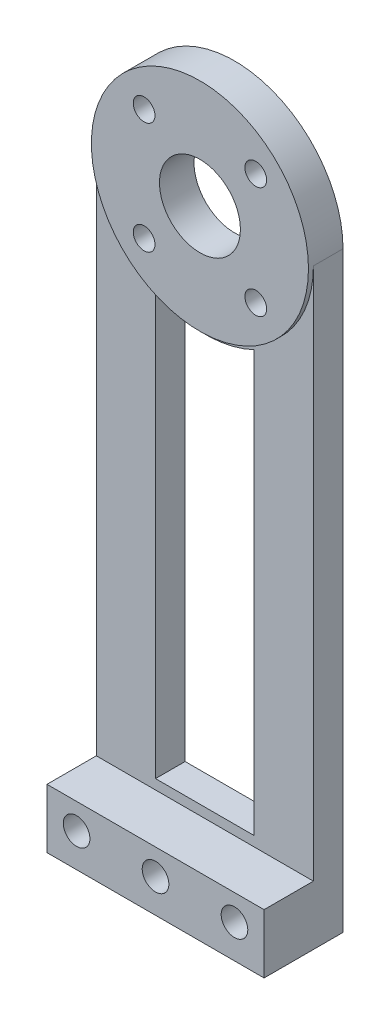
ISO-10303-21;
HEADER;
FILE_DESCRIPTION(('STEP AP214'),'2;1');
FILE_NAME('part.step','',(''),(''),'','','');
FILE_SCHEMA(('AUTOMOTIVE_DESIGN { 1 0 10303 214 1 1 1 1 }'));
ENDSEC;
DATA;
#1=APPLICATION_CONTEXT('core data for automotive mechanical design processes');
#2=APPLICATION_PROTOCOL_DEFINITION('international standard','automotive_design',2000,#1);
#3=PRODUCT_CONTEXT('',#1,'mechanical');
#4=PRODUCT('Part','Part','',(#3));
#5=PRODUCT_RELATED_PRODUCT_CATEGORY('part','',(#4));
#6=PRODUCT_DEFINITION_FORMATION('','',#4);
#7=PRODUCT_DEFINITION_CONTEXT('part definition',#1,'design');
#8=PRODUCT_DEFINITION('design','',#6,#7);
#9=PRODUCT_DEFINITION_SHAPE('','',#8);
#10=(LENGTH_UNIT() NAMED_UNIT(*) SI_UNIT(.MILLI.,.METRE.));
#11=(NAMED_UNIT(*) PLANE_ANGLE_UNIT() SI_UNIT($,.RADIAN.));
#12=(NAMED_UNIT(*) SI_UNIT($,.STERADIAN.) SOLID_ANGLE_UNIT());
#13=UNCERTAINTY_MEASURE_WITH_UNIT(LENGTH_MEASURE(1.E-05),#10,'distance_accuracy_value','');
#14=(GEOMETRIC_REPRESENTATION_CONTEXT(3) GLOBAL_UNCERTAINTY_ASSIGNED_CONTEXT((#13)) GLOBAL_UNIT_ASSIGNED_CONTEXT((#10,
#11,#12)) REPRESENTATION_CONTEXT('',''));
#15=CARTESIAN_POINT('',(0.,0.,0.));
#16=DIRECTION('',(0.,0.,1.));
#17=DIRECTION('',(1.,0.,0.));
#18=AXIS2_PLACEMENT_3D('',#15,#16,#17);
#19=CARTESIAN_POINT('',(-5.65685424949235,24.3431457505076,12.0965512114594));
#20=DIRECTION('',(0.,0.,-1.));
#21=DIRECTION('',(1.,0.,0.));
#22=AXIS2_PLACEMENT_3D('',#19,#20,#21);
#23=CYLINDRICAL_SURFACE('',#22,1.10000000000001);
#24=CARTESIAN_POINT('',(-5.65685424949235,24.3431457505076,0.5));
#25=DIRECTION('',(0.,0.,1.));
#26=DIRECTION('',(1.,0.,0.));
#27=AXIS2_PLACEMENT_3D('',#24,#25,#26);
#28=CIRCLE('',#27,1.10000000000001);
#29=CARTESIAN_POINT('',(-4.55685424949234,24.3431457505076,0.5));
#30=VERTEX_POINT('',#29);
#31=EDGE_CURVE('E252',#30,#30,#28,.F.);
#32=ORIENTED_EDGE('',*,*,#31,.F.);
#33=EDGE_LOOP('',(#32));
#34=FACE_BOUND('',#33,.T.);
#35=CARTESIAN_POINT('',(-5.65685424949235,24.3431457505076,-2.5));
#36=DIRECTION('',(0.,0.,1.));
#37=DIRECTION('',(1.,0.,0.));
#38=AXIS2_PLACEMENT_3D('',#35,#36,#37);
#39=CIRCLE('',#38,1.10000000000001);
#40=CARTESIAN_POINT('',(-4.55685424949234,24.3431457505076,-2.5));
#41=VERTEX_POINT('',#40);
#42=EDGE_CURVE('E239',#41,#41,#39,.F.);
#43=ORIENTED_EDGE('',*,*,#42,.T.);
#44=EDGE_LOOP('',(#43));
#45=FACE_BOUND('',#44,.T.);
#46=ADVANCED_FACE('F67',(#34,#45),#23,.F.);
#47=CARTESIAN_POINT('',(-5.65685424949243,35.6568542494923,12.0965512114594));
#48=DIRECTION('',(0.,0.,-1.));
#49=DIRECTION('',(1.,0.,0.));
#50=AXIS2_PLACEMENT_3D('',#47,#48,#49);
#51=CYLINDRICAL_SURFACE('',#50,1.10000000000001);
#52=CARTESIAN_POINT('',(-5.65685424949243,35.6568542494923,0.5));
#53=DIRECTION('',(0.,0.,1.));
#54=DIRECTION('',(1.,0.,0.));
#55=AXIS2_PLACEMENT_3D('',#52,#53,#54);
#56=CIRCLE('',#55,1.10000000000001);
#57=CARTESIAN_POINT('',(-4.55685424949242,35.6568542494923,0.5));
#58=VERTEX_POINT('',#57);
#59=EDGE_CURVE('E255',#58,#58,#56,.F.);
#60=ORIENTED_EDGE('',*,*,#59,.F.);
#61=EDGE_LOOP('',(#60));
#62=FACE_BOUND('',#61,.T.);
#63=CARTESIAN_POINT('',(-5.65685424949243,35.6568542494923,-2.5));
#64=DIRECTION('',(0.,0.,1.));
#65=DIRECTION('',(1.,0.,0.));
#66=AXIS2_PLACEMENT_3D('',#63,#64,#65);
#67=CIRCLE('',#66,1.10000000000001);
#68=CARTESIAN_POINT('',(-4.55685424949242,35.6568542494923,-2.5));
#69=VERTEX_POINT('',#68);
#70=EDGE_CURVE('E229',#69,#69,#67,.F.);
#71=ORIENTED_EDGE('',*,*,#70,.T.);
#72=EDGE_LOOP('',(#71));
#73=FACE_BOUND('',#72,.T.);
#74=ADVANCED_FACE('F300',(#62,#73),#51,.F.);
#75=CARTESIAN_POINT('',(5.65685424949247,24.3431457505077,12.0965512114594));
#76=DIRECTION('',(0.,0.,-1.));
#77=DIRECTION('',(1.,0.,0.));
#78=AXIS2_PLACEMENT_3D('',#75,#76,#77);
#79=CYLINDRICAL_SURFACE('',#78,1.10000000000001);
#80=CARTESIAN_POINT('',(5.65685424949247,24.3431457505077,0.5));
#81=DIRECTION('',(0.,0.,1.));
#82=DIRECTION('',(1.,0.,0.));
#83=AXIS2_PLACEMENT_3D('',#80,#81,#82);
#84=CIRCLE('',#83,1.10000000000001);
#85=CARTESIAN_POINT('',(6.75685424949248,24.3431457505077,0.5));
#86=VERTEX_POINT('',#85);
#87=EDGE_CURVE('E235',#86,#86,#84,.F.);
#88=ORIENTED_EDGE('',*,*,#87,.F.);
#89=EDGE_LOOP('',(#88));
#90=FACE_BOUND('',#89,.T.);
#91=CARTESIAN_POINT('',(5.65685424949247,24.3431457505077,-2.5));
#92=DIRECTION('',(0.,0.,1.));
#93=DIRECTION('',(1.,0.,0.));
#94=AXIS2_PLACEMENT_3D('',#91,#92,#93);
#95=CIRCLE('',#94,1.10000000000001);
#96=CARTESIAN_POINT('',(6.75685424949248,24.3431457505077,-2.5));
#97=VERTEX_POINT('',#96);
#98=EDGE_CURVE('E220',#97,#97,#95,.F.);
#99=ORIENTED_EDGE('',*,*,#98,.T.);
#100=EDGE_LOOP('',(#99));
#101=FACE_BOUND('',#100,.T.);
#102=ADVANCED_FACE('F306',(#90,#101),#79,.F.);
#103=CARTESIAN_POINT('',(5.65685424949234,35.6568542494924,12.0965512114594));
#104=DIRECTION('',(0.,0.,-1.));
#105=DIRECTION('',(1.,0.,0.));
#106=AXIS2_PLACEMENT_3D('',#103,#104,#105);
#107=CYLINDRICAL_SURFACE('',#106,1.10000000000001);
#108=CARTESIAN_POINT('',(5.65685424949234,35.6568542494924,0.5));
#109=DIRECTION('',(0.,0.,1.));
#110=DIRECTION('',(1.,0.,0.));
#111=AXIS2_PLACEMENT_3D('',#108,#109,#110);
#112=CIRCLE('',#111,1.10000000000001);
#113=CARTESIAN_POINT('',(6.75685424949235,35.6568542494924,0.5));
#114=VERTEX_POINT('',#113);
#115=EDGE_CURVE('E269',#114,#114,#112,.F.);
#116=ORIENTED_EDGE('',*,*,#115,.F.);
#117=EDGE_LOOP('',(#116));
#118=FACE_BOUND('',#117,.T.);
#119=CARTESIAN_POINT('',(5.65685424949234,35.6568542494924,-2.5));
#120=DIRECTION('',(0.,0.,1.));
#121=DIRECTION('',(1.,0.,0.));
#122=AXIS2_PLACEMENT_3D('',#119,#120,#121);
#123=CIRCLE('',#122,1.10000000000001);
#124=CARTESIAN_POINT('',(6.75685424949235,35.6568542494924,-2.5));
#125=VERTEX_POINT('',#124);
#126=EDGE_CURVE('E258',#125,#125,#123,.F.);
#127=ORIENTED_EDGE('',*,*,#126,.T.);
#128=EDGE_LOOP('',(#127));
#129=FACE_BOUND('',#128,.T.);
#130=ADVANCED_FACE('F317',(#118,#129),#107,.F.);
#131=CARTESIAN_POINT('',(11.,0.,-3.));
#132=DIRECTION('',(1.,0.,0.));
#133=DIRECTION('',(0.,1.,0.));
#134=AXIS2_PLACEMENT_3D('',#131,#132,#133);
#135=PLANE('',#134);
#136=DIRECTION('',(0.,0.,1.));
#137=VECTOR('',#136,1.);
#138=CARTESIAN_POINT('',(11.,-30.,-3.));
#139=LINE('',#138,#137);
#140=CARTESIAN_POINT('',(11.,-30.,-3.));
#141=VERTEX_POINT('',#140);
#142=CARTESIAN_POINT('',(11.,-30.,5.));
#143=VERTEX_POINT('',#142);
#144=EDGE_CURVE('E155',#141,#143,#139,.T.);
#145=ORIENTED_EDGE('',*,*,#144,.F.);
#146=DIRECTION('',(0.,-1.,0.));
#147=VECTOR('',#146,1.);
#148=CARTESIAN_POINT('',(11.,0.,-3.));
#149=LINE('',#148,#147);
#150=CARTESIAN_POINT('',(11.,30.,-3.));
#151=VERTEX_POINT('',#150);
#152=EDGE_CURVE('E173',#151,#141,#149,.T.);
#153=ORIENTED_EDGE('',*,*,#152,.F.);
#154=DIRECTION('',(0.,0.,1.));
#155=VECTOR('',#154,1.);
#156=CARTESIAN_POINT('',(11.,30.,-3.));
#157=LINE('',#156,#155);
#158=CARTESIAN_POINT('',(11.,30.,0.));
#159=VERTEX_POINT('',#158);
#160=EDGE_CURVE('E175',#151,#159,#157,.T.);
#161=ORIENTED_EDGE('',*,*,#160,.T.);
#162=DIRECTION('',(0.,-1.,0.));
#163=VECTOR('',#162,1.);
#164=CARTESIAN_POINT('',(11.,0.,0.));
#165=LINE('',#164,#163);
#166=CARTESIAN_POINT('',(11.,-24.,0.));
#167=VERTEX_POINT('',#166);
#168=EDGE_CURVE('E159',#159,#167,#165,.T.);
#169=ORIENTED_EDGE('',*,*,#168,.T.);
#170=DIRECTION('',(0.,0.,-1.));
#171=VECTOR('',#170,1.);
#172=CARTESIAN_POINT('',(11.,-24.,5.));
#173=LINE('',#172,#171);
#174=CARTESIAN_POINT('',(11.,-24.,5.));
#175=VERTEX_POINT('',#174);
#176=EDGE_CURVE('E209',#175,#167,#173,.T.);
#177=ORIENTED_EDGE('',*,*,#176,.F.);
#178=DIRECTION('',(0.,-1.,0.));
#179=VECTOR('',#178,1.);
#180=CARTESIAN_POINT('',(11.,0.,5.));
#181=LINE('',#180,#179);
#182=EDGE_CURVE('E472',#175,#143,#181,.T.);
#183=ORIENTED_EDGE('',*,*,#182,.T.);
#184=EDGE_LOOP('',(#145,#153,#161,#169,#177,#183));
#185=FACE_BOUND('',#184,.T.);
#186=ADVANCED_FACE('F69',(#185),#135,.T.);
#187=CARTESIAN_POINT('',(0.,0.,0.));
#188=DIRECTION('',(0.,0.,-1.));
#189=DIRECTION('',(1.,0.,0.));
#190=AXIS2_PLACEMENT_3D('',#187,#188,#189);
#191=PLANE('',#190);
#192=ORIENTED_EDGE('',*,*,#168,.F.);
#193=CARTESIAN_POINT('',(0.,30.,0.));
#194=DIRECTION('',(0.,0.,1.));
#195=DIRECTION('',(1.,0.,0.));
#196=AXIS2_PLACEMENT_3D('',#193,#194,#195);
#197=CIRCLE('',#196,11.);
#198=CARTESIAN_POINT('',(-11.,30.,0.));
#199=VERTEX_POINT('',#198);
#200=EDGE_CURVE('E13',#199,#159,#197,.T.);
#201=ORIENTED_EDGE('',*,*,#200,.F.);
#202=DIRECTION('',(0.,-1.,0.));
#203=VECTOR('',#202,1.);
#204=CARTESIAN_POINT('',(-11.,0.,0.));
#205=LINE('',#204,#203);
#206=CARTESIAN_POINT('',(-11.,-24.,0.));
#207=VERTEX_POINT('',#206);
#208=EDGE_CURVE('E162',#199,#207,#205,.T.);
#209=ORIENTED_EDGE('',*,*,#208,.T.);
#210=DIRECTION('',(-1.,0.,0.));
#211=VECTOR('',#210,1.);
#212=CARTESIAN_POINT('',(0.,-24.,0.));
#213=LINE('',#212,#211);
#214=EDGE_CURVE('E199',#167,#207,#213,.T.);
#215=ORIENTED_EDGE('',*,*,#214,.F.);
#216=EDGE_LOOP('',(#192,#201,#209,#215));
#217=FACE_BOUND('',#216,.T.);
#218=CARTESIAN_POINT('',(0.,30.,0.));
#219=DIRECTION('',(0.,0.,1.));
#220=DIRECTION('',(1.,0.,0.));
#221=AXIS2_PLACEMENT_3D('',#218,#219,#220);
#222=CIRCLE('',#221,11.5);
#223=CARTESIAN_POINT('',(-4.99999999999999,19.643842411396,0.));
#224=VERTEX_POINT('',#223);
#225=CARTESIAN_POINT('',(4.99999999999999,19.643842411396,0.));
#226=VERTEX_POINT('',#225);
#227=EDGE_CURVE('E165',#224,#226,#222,.T.);
#228=ORIENTED_EDGE('',*,*,#227,.T.);
#229=DIRECTION('',(0.,-1.,0.));
#230=VECTOR('',#229,1.);
#231=CARTESIAN_POINT('',(5.,0.,0.));
#232=LINE('',#231,#230);
#233=CARTESIAN_POINT('',(5.,-23.,0.));
#234=VERTEX_POINT('',#233);
#235=EDGE_CURVE('E168',#226,#234,#232,.T.);
#236=ORIENTED_EDGE('',*,*,#235,.T.);
#237=DIRECTION('',(1.,0.,0.));
#238=VECTOR('',#237,1.);
#239=CARTESIAN_POINT('',(0.,-23.,0.));
#240=LINE('',#239,#238);
#241=CARTESIAN_POINT('',(-5.,-23.,0.));
#242=VERTEX_POINT('',#241);
#243=EDGE_CURVE('E139',#242,#234,#240,.T.);
#244=ORIENTED_EDGE('',*,*,#243,.F.);
#245=DIRECTION('',(0.,-1.,0.));
#246=VECTOR('',#245,1.);
#247=CARTESIAN_POINT('',(-5.,0.,0.));
#248=LINE('',#247,#246);
#249=EDGE_CURVE('E171',#224,#242,#248,.T.);
#250=ORIENTED_EDGE('',*,*,#249,.F.);
#251=EDGE_LOOP('',(#228,#236,#244,#250));
#252=FACE_BOUND('',#251,.T.);
#253=ADVANCED_FACE('F196',(#217,#252),#191,.F.);
#254=CARTESIAN_POINT('',(0.,-30.,-3.));
#255=DIRECTION('',(0.,1.,0.));
#256=DIRECTION('',(-1.,0.,0.));
#257=AXIS2_PLACEMENT_3D('',#254,#255,#256);
#258=PLANE('',#257);
#259=DIRECTION('',(0.,0.,1.));
#260=VECTOR('',#259,1.);
#261=CARTESIAN_POINT('',(-11.,-30.,-3.));
#262=LINE('',#261,#260);
#263=CARTESIAN_POINT('',(-11.,-30.,-3.));
#264=VERTEX_POINT('',#263);
#265=CARTESIAN_POINT('',(-11.,-30.,5.));
#266=VERTEX_POINT('',#265);
#267=EDGE_CURVE('E71',#264,#266,#262,.T.);
#268=ORIENTED_EDGE('',*,*,#267,.F.);
#269=DIRECTION('',(1.,0.,0.));
#270=VECTOR('',#269,1.);
#271=CARTESIAN_POINT('',(0.,-30.,-3.));
#272=LINE('',#271,#270);
#273=EDGE_CURVE('E286',#264,#141,#272,.T.);
#274=ORIENTED_EDGE('',*,*,#273,.T.);
#275=ORIENTED_EDGE('',*,*,#144,.T.);
#276=DIRECTION('',(1.,0.,0.));
#277=VECTOR('',#276,1.);
#278=CARTESIAN_POINT('',(0.,-30.,5.));
#279=LINE('',#278,#277);
#280=EDGE_CURVE('E205',#266,#143,#279,.T.);
#281=ORIENTED_EDGE('',*,*,#280,.F.);
#282=EDGE_LOOP('',(#268,#274,#275,#281));
#283=FACE_BOUND('',#282,.T.);
#284=ADVANCED_FACE('F339',(#283),#258,.F.);
#285=CARTESIAN_POINT('',(0.,0.,-3.));
#286=DIRECTION('',(0.,0.,-1.));
#287=DIRECTION('',(1.,0.,0.));
#288=AXIS2_PLACEMENT_3D('',#285,#286,#287);
#289=PLANE('',#288);
#290=CARTESIAN_POINT('',(8.,-26.6,-3.));
#291=DIRECTION('',(0.,0.,1.));
#292=DIRECTION('',(1.,0.,0.));
#293=AXIS2_PLACEMENT_3D('',#290,#291,#292);
#294=CIRCLE('',#293,1.35);
#295=CARTESIAN_POINT('',(9.35,-26.6,-3.));
#296=VERTEX_POINT('',#295);
#297=EDGE_CURVE('E482',#296,#296,#294,.T.);
#298=ORIENTED_EDGE('',*,*,#297,.T.);
#299=EDGE_LOOP('',(#298));
#300=FACE_BOUND('',#299,.T.);
#301=CARTESIAN_POINT('',(-8.,-26.6,-3.));
#302=DIRECTION('',(0.,0.,1.));
#303=DIRECTION('',(1.,0.,0.));
#304=AXIS2_PLACEMENT_3D('',#301,#302,#303);
#305=CIRCLE('',#304,1.35);
#306=CARTESIAN_POINT('',(-6.65,-26.6,-3.));
#307=VERTEX_POINT('',#306);
#308=EDGE_CURVE('E483',#307,#307,#305,.T.);
#309=ORIENTED_EDGE('',*,*,#308,.T.);
#310=EDGE_LOOP('',(#309));
#311=FACE_BOUND('',#310,.T.);
#312=CARTESIAN_POINT('',(0.,-26.6,-3.));
#313=DIRECTION('',(0.,0.,1.));
#314=DIRECTION('',(1.,0.,0.));
#315=AXIS2_PLACEMENT_3D('',#312,#313,#314);
#316=CIRCLE('',#315,1.35);
#317=CARTESIAN_POINT('',(1.35,-26.6,-3.));
#318=VERTEX_POINT('',#317);
#319=EDGE_CURVE('E479',#318,#318,#316,.T.);
#320=ORIENTED_EDGE('',*,*,#319,.T.);
#321=EDGE_LOOP('',(#320));
#322=FACE_BOUND('',#321,.T.);
#323=CARTESIAN_POINT('',(-5.65685424949243,35.6568542494923,-3.));
#324=DIRECTION('',(0.,0.,1.));
#325=DIRECTION('',(0.,1.,0.));
#326=AXIS2_PLACEMENT_3D('',#323,#324,#325);
#327=CIRCLE('',#326,2.00000000000001);
#328=CARTESIAN_POINT('',(-5.65685424949244,37.6568542494923,-3.));
#329=VERTEX_POINT('',#328);
#330=EDGE_CURVE('E225',#329,#329,#327,.T.);
#331=ORIENTED_EDGE('',*,*,#330,.T.);
#332=EDGE_LOOP('',(#331));
#333=FACE_BOUND('',#332,.T.);
#334=CARTESIAN_POINT('',(-5.65685424949235,24.3431457505076,-3.));
#335=DIRECTION('',(0.,0.,1.));
#336=DIRECTION('',(-1.,0.,0.));
#337=AXIS2_PLACEMENT_3D('',#334,#335,#336);
#338=CIRCLE('',#337,2.00000000000001);
#339=CARTESIAN_POINT('',(-7.65685424949236,24.3431457505076,-3.));
#340=VERTEX_POINT('',#339);
#341=EDGE_CURVE('E236',#340,#340,#338,.T.);
#342=ORIENTED_EDGE('',*,*,#341,.T.);
#343=EDGE_LOOP('',(#342));
#344=FACE_BOUND('',#343,.T.);
#345=CARTESIAN_POINT('',(5.65685424949247,24.3431457505077,-3.));
#346=DIRECTION('',(0.,0.,1.));
#347=DIRECTION('',(0.,-1.,0.));
#348=AXIS2_PLACEMENT_3D('',#345,#346,#347);
#349=CIRCLE('',#348,2.00000000000001);
#350=CARTESIAN_POINT('',(5.65685424949249,22.3431457505077,-3.));
#351=VERTEX_POINT('',#350);
#352=EDGE_CURVE('E245',#351,#351,#349,.T.);
#353=ORIENTED_EDGE('',*,*,#352,.T.);
#354=EDGE_LOOP('',(#353));
#355=FACE_BOUND('',#354,.T.);
#356=CARTESIAN_POINT('',(5.65685424949234,35.6568542494924,-3.));
#357=DIRECTION('',(0.,0.,1.));
#358=DIRECTION('',(1.,0.,0.));
#359=AXIS2_PLACEMENT_3D('',#356,#357,#358);
#360=CIRCLE('',#359,2.00000000000001);
#361=CARTESIAN_POINT('',(7.65685424949235,35.6568542494924,-3.));
#362=VERTEX_POINT('',#361);
#363=EDGE_CURVE('E261',#362,#362,#360,.T.);
#364=ORIENTED_EDGE('',*,*,#363,.T.);
#365=EDGE_LOOP('',(#364));
#366=FACE_BOUND('',#365,.T.);
#367=CARTESIAN_POINT('',(0.,30.,-3.));
#368=DIRECTION('',(0.,0.,1.));
#369=DIRECTION('',(1.,0.,0.));
#370=AXIS2_PLACEMENT_3D('',#367,#368,#369);
#371=CIRCLE('',#370,4.1);
#372=CARTESIAN_POINT('',(4.1,30.,-3.));
#373=VERTEX_POINT('',#372);
#374=EDGE_CURVE('E270',#373,#373,#371,.T.);
#375=ORIENTED_EDGE('',*,*,#374,.T.);
#376=EDGE_LOOP('',(#375));
#377=FACE_BOUND('',#376,.T.);
#378=DIRECTION('',(0.,-1.,0.));
#379=VECTOR('',#378,1.);
#380=CARTESIAN_POINT('',(-11.,0.,-3.));
#381=LINE('',#380,#379);
#382=CARTESIAN_POINT('',(-11.,30.,-3.));
#383=VERTEX_POINT('',#382);
#384=EDGE_CURVE('E283',#383,#264,#381,.T.);
#385=ORIENTED_EDGE('',*,*,#384,.F.);
#386=CARTESIAN_POINT('',(0.,30.,-3.));
#387=DIRECTION('',(0.,0.,1.));
#388=DIRECTION('',(1.,0.,0.));
#389=AXIS2_PLACEMENT_3D('',#386,#387,#388);
#390=CIRCLE('',#389,11.);
#391=EDGE_CURVE('E115',#151,#383,#390,.T.);
#392=ORIENTED_EDGE('',*,*,#391,.F.);
#393=ORIENTED_EDGE('',*,*,#152,.T.);
#394=ORIENTED_EDGE('',*,*,#273,.F.);
#395=EDGE_LOOP('',(#385,#392,#393,#394));
#396=FACE_BOUND('',#395,.T.);
#397=CARTESIAN_POINT('',(0.,30.,-3.));
#398=DIRECTION('',(0.,0.,1.));
#399=DIRECTION('',(1.,0.,0.));
#400=AXIS2_PLACEMENT_3D('',#397,#398,#399);
#401=CIRCLE('',#400,11.5);
#402=CARTESIAN_POINT('',(-4.99999999999999,19.643842411396,-3.));
#403=VERTEX_POINT('',#402);
#404=CARTESIAN_POINT('',(4.99999999999999,19.643842411396,-3.));
#405=VERTEX_POINT('',#404);
#406=EDGE_CURVE('E150',#403,#405,#401,.T.);
#407=ORIENTED_EDGE('',*,*,#406,.F.);
#408=DIRECTION('',(0.,-1.,0.));
#409=VECTOR('',#408,1.);
#410=CARTESIAN_POINT('',(-5.,0.,-3.));
#411=LINE('',#410,#409);
#412=CARTESIAN_POINT('',(-5.,-23.,-3.));
#413=VERTEX_POINT('',#412);
#414=EDGE_CURVE('E153',#403,#413,#411,.T.);
#415=ORIENTED_EDGE('',*,*,#414,.T.);
#416=DIRECTION('',(1.,0.,0.));
#417=VECTOR('',#416,1.);
#418=CARTESIAN_POINT('',(0.,-23.,-3.));
#419=LINE('',#418,#417);
#420=CARTESIAN_POINT('',(5.,-23.,-3.));
#421=VERTEX_POINT('',#420);
#422=EDGE_CURVE('E136',#413,#421,#419,.T.);
#423=ORIENTED_EDGE('',*,*,#422,.T.);
#424=DIRECTION('',(0.,-1.,0.));
#425=VECTOR('',#424,1.);
#426=CARTESIAN_POINT('',(5.,0.,-3.));
#427=LINE('',#426,#425);
#428=EDGE_CURVE('E146',#405,#421,#427,.T.);
#429=ORIENTED_EDGE('',*,*,#428,.F.);
#430=EDGE_LOOP('',(#407,#415,#423,#429));
#431=FACE_BOUND('',#430,.T.);
#432=ADVANCED_FACE('F152',(#300,#311,#322,#333,#344,#355,#366,#377,#396,#431),#289,.T.);
#433=CARTESIAN_POINT('',(0.,30.,-3.));
#434=DIRECTION('',(0.,0.,1.));
#435=DIRECTION('',(-1.,0.,0.));
#436=AXIS2_PLACEMENT_3D('',#433,#434,#435);
#437=CYLINDRICAL_SURFACE('',#436,11.);
#438=ORIENTED_EDGE('',*,*,#160,.F.);
#439=ORIENTED_EDGE('',*,*,#391,.T.);
#440=DIRECTION('',(0.,0.,1.));
#441=VECTOR('',#440,1.);
#442=CARTESIAN_POINT('',(-11.,30.,-3.));
#443=LINE('',#442,#441);
#444=EDGE_CURVE('E180',#383,#199,#443,.T.);
#445=ORIENTED_EDGE('',*,*,#444,.T.);
#446=ORIENTED_EDGE('',*,*,#200,.T.);
#447=EDGE_LOOP('',(#438,#439,#445,#446));
#448=FACE_BOUND('',#447,.T.);
#449=CARTESIAN_POINT('',(0.,30.,0.5));
#450=DIRECTION('',(0.,0.,1.));
#451=DIRECTION('',(1.,0.,0.));
#452=AXIS2_PLACEMENT_3D('',#449,#450,#451);
#453=CIRCLE('',#452,11.);
#454=CARTESIAN_POINT('',(11.,30.,0.5));
#455=VERTEX_POINT('',#454);
#456=EDGE_CURVE('E276',#455,#455,#453,.T.);
#457=ORIENTED_EDGE('',*,*,#456,.F.);
#458=EDGE_LOOP('',(#457));
#459=FACE_BOUND('',#458,.T.);
#460=ADVANCED_FACE('F190',(#448,#459),#437,.T.);
#461=CARTESIAN_POINT('',(-11.,0.,-3.));
#462=DIRECTION('',(1.,0.,0.));
#463=DIRECTION('',(0.,1.,0.));
#464=AXIS2_PLACEMENT_3D('',#461,#462,#463);
#465=PLANE('',#464);
#466=ORIENTED_EDGE('',*,*,#208,.F.);
#467=ORIENTED_EDGE('',*,*,#444,.F.);
#468=ORIENTED_EDGE('',*,*,#384,.T.);
#469=ORIENTED_EDGE('',*,*,#267,.T.);
#470=DIRECTION('',(0.,-1.,0.));
#471=VECTOR('',#470,1.);
#472=CARTESIAN_POINT('',(-11.,0.,5.));
#473=LINE('',#472,#471);
#474=CARTESIAN_POINT('',(-11.,-24.,5.));
#475=VERTEX_POINT('',#474);
#476=EDGE_CURVE('E217',#475,#266,#473,.T.);
#477=ORIENTED_EDGE('',*,*,#476,.F.);
#478=DIRECTION('',(0.,0.,-1.));
#479=VECTOR('',#478,1.);
#480=CARTESIAN_POINT('',(-11.,-24.,5.));
#481=LINE('',#480,#479);
#482=EDGE_CURVE('E216',#475,#207,#481,.T.);
#483=ORIENTED_EDGE('',*,*,#482,.T.);
#484=EDGE_LOOP('',(#466,#467,#468,#469,#477,#483));
#485=FACE_BOUND('',#484,.T.);
#486=ADVANCED_FACE('F460',(#485),#465,.F.);
#487=CARTESIAN_POINT('',(5.,0.,-3.));
#488=DIRECTION('',(1.,0.,0.));
#489=DIRECTION('',(0.,1.,0.));
#490=AXIS2_PLACEMENT_3D('',#487,#488,#489);
#491=PLANE('',#490);
#492=ORIENTED_EDGE('',*,*,#235,.F.);
#493=DIRECTION('',(0.,0.,1.));
#494=VECTOR('',#493,1.);
#495=CARTESIAN_POINT('',(4.99999999999999,19.643842411396,-3.));
#496=LINE('',#495,#494);
#497=EDGE_CURVE('E77',#405,#226,#496,.T.);
#498=ORIENTED_EDGE('',*,*,#497,.F.);
#499=ORIENTED_EDGE('',*,*,#428,.T.);
#500=DIRECTION('',(0.,0.,1.));
#501=VECTOR('',#500,1.);
#502=CARTESIAN_POINT('',(5.,-23.,-3.));
#503=LINE('',#502,#501);
#504=EDGE_CURVE('E132',#421,#234,#503,.T.);
#505=ORIENTED_EDGE('',*,*,#504,.T.);
#506=EDGE_LOOP('',(#492,#498,#499,#505));
#507=FACE_BOUND('',#506,.T.);
#508=ADVANCED_FACE('F147',(#507),#491,.F.);
#509=CARTESIAN_POINT('',(0.,-23.,-3.));
#510=DIRECTION('',(0.,1.,0.));
#511=DIRECTION('',(0.,0.,-1.));
#512=AXIS2_PLACEMENT_3D('',#509,#510,#511);
#513=PLANE('',#512);
#514=ORIENTED_EDGE('',*,*,#243,.T.);
#515=ORIENTED_EDGE('',*,*,#504,.F.);
#516=ORIENTED_EDGE('',*,*,#422,.F.);
#517=DIRECTION('',(0.,0.,1.));
#518=VECTOR('',#517,1.);
#519=CARTESIAN_POINT('',(-5.,-23.,-3.));
#520=LINE('',#519,#518);
#521=EDGE_CURVE('E143',#413,#242,#520,.T.);
#522=ORIENTED_EDGE('',*,*,#521,.T.);
#523=EDGE_LOOP('',(#514,#515,#516,#522));
#524=FACE_BOUND('',#523,.T.);
#525=ADVANCED_FACE('F134',(#524),#513,.T.);
#526=CARTESIAN_POINT('',(-5.,0.,-3.));
#527=DIRECTION('',(1.,0.,0.));
#528=DIRECTION('',(0.,1.,0.));
#529=AXIS2_PLACEMENT_3D('',#526,#527,#528);
#530=PLANE('',#529);
#531=ORIENTED_EDGE('',*,*,#249,.T.);
#532=ORIENTED_EDGE('',*,*,#521,.F.);
#533=ORIENTED_EDGE('',*,*,#414,.F.);
#534=DIRECTION('',(0.,0.,1.));
#535=VECTOR('',#534,1.);
#536=CARTESIAN_POINT('',(-4.99999999999999,19.643842411396,-3.));
#537=LINE('',#536,#535);
#538=EDGE_CURVE('E86',#403,#224,#537,.T.);
#539=ORIENTED_EDGE('',*,*,#538,.T.);
#540=EDGE_LOOP('',(#531,#532,#533,#539));
#541=FACE_BOUND('',#540,.T.);
#542=ADVANCED_FACE('F288',(#541),#530,.T.);
#543=CARTESIAN_POINT('',(0.,30.,-3.));
#544=DIRECTION('',(0.,0.,1.));
#545=DIRECTION('',(-1.,0.,0.));
#546=AXIS2_PLACEMENT_3D('',#543,#544,#545);
#547=CYLINDRICAL_SURFACE('',#546,11.5);
#548=ORIENTED_EDGE('',*,*,#227,.F.);
#549=ORIENTED_EDGE('',*,*,#538,.F.);
#550=ORIENTED_EDGE('',*,*,#406,.T.);
#551=ORIENTED_EDGE('',*,*,#497,.T.);
#552=EDGE_LOOP('',(#548,#549,#550,#551));
#553=FACE_BOUND('',#552,.T.);
#554=ADVANCED_FACE('F287',(#553),#547,.T.);
#555=CARTESIAN_POINT('',(0.,0.,0.5));
#556=DIRECTION('',(0.,0.,-1.));
#557=DIRECTION('',(1.,0.,0.));
#558=AXIS2_PLACEMENT_3D('',#555,#556,#557);
#559=PLANE('',#558);
#560=ORIENTED_EDGE('',*,*,#87,.T.);
#561=EDGE_LOOP('',(#560));
#562=FACE_BOUND('',#561,.T.);
#563=ORIENTED_EDGE('',*,*,#59,.T.);
#564=EDGE_LOOP('',(#563));
#565=FACE_BOUND('',#564,.T.);
#566=ORIENTED_EDGE('',*,*,#31,.T.);
#567=EDGE_LOOP('',(#566));
#568=FACE_BOUND('',#567,.T.);
#569=CARTESIAN_POINT('',(0.,30.,0.5));
#570=DIRECTION('',(0.,0.,1.));
#571=DIRECTION('',(1.,0.,0.));
#572=AXIS2_PLACEMENT_3D('',#569,#570,#571);
#573=CIRCLE('',#572,4.1);
#574=CARTESIAN_POINT('',(4.1,30.,0.5));
#575=VERTEX_POINT('',#574);
#576=EDGE_CURVE('E273',#575,#575,#573,.F.);
#577=ORIENTED_EDGE('',*,*,#576,.T.);
#578=EDGE_LOOP('',(#577));
#579=FACE_BOUND('',#578,.T.);
#580=ORIENTED_EDGE('',*,*,#115,.T.);
#581=EDGE_LOOP('',(#580));
#582=FACE_BOUND('',#581,.T.);
#583=ORIENTED_EDGE('',*,*,#456,.T.);
#584=EDGE_LOOP('',(#583));
#585=FACE_BOUND('',#584,.T.);
#586=ADVANCED_FACE('F295',(#562,#565,#568,#579,#582,#585),#559,.F.);
#587=CARTESIAN_POINT('',(0.,30.,12.0965512114594));
#588=DIRECTION('',(0.,0.,-1.));
#589=DIRECTION('',(1.,0.,0.));
#590=AXIS2_PLACEMENT_3D('',#587,#588,#589);
#591=CYLINDRICAL_SURFACE('',#590,4.1);
#592=ORIENTED_EDGE('',*,*,#576,.F.);
#593=EDGE_LOOP('',(#592));
#594=FACE_BOUND('',#593,.T.);
#595=ORIENTED_EDGE('',*,*,#374,.F.);
#596=EDGE_LOOP('',(#595));
#597=FACE_BOUND('',#596,.T.);
#598=ADVANCED_FACE('F323',(#594,#597),#591,.F.);
#599=CARTESIAN_POINT('',(5.65685424949234,35.6568542494924,6.1568542494924));
#600=DIRECTION('',(0.,0.,-1.));
#601=DIRECTION('',(1.,0.,0.));
#602=AXIS2_PLACEMENT_3D('',#599,#600,#601);
#603=CYLINDRICAL_SURFACE('',#602,2.00000000000001);
#604=CARTESIAN_POINT('',(5.65685424949234,35.6568542494924,-2.5));
#605=DIRECTION('',(0.,0.,1.));
#606=DIRECTION('',(1.,0.,0.));
#607=AXIS2_PLACEMENT_3D('',#604,#605,#606);
#608=CIRCLE('',#607,2.00000000000001);
#609=CARTESIAN_POINT('',(7.65685424949235,35.6568542494924,-2.5));
#610=VERTEX_POINT('',#609);
#611=EDGE_CURVE('E264',#610,#610,#608,.F.);
#612=ORIENTED_EDGE('',*,*,#611,.F.);
#613=EDGE_LOOP('',(#612));
#614=FACE_BOUND('',#613,.T.);
#615=ORIENTED_EDGE('',*,*,#363,.F.);
#616=EDGE_LOOP('',(#615));
#617=FACE_BOUND('',#616,.T.);
#618=ADVANCED_FACE('F319',(#614,#617),#603,.F.);
#619=CARTESIAN_POINT('',(0.,0.,-2.5));
#620=DIRECTION('',(0.,0.,-1.));
#621=DIRECTION('',(1.,0.,0.));
#622=AXIS2_PLACEMENT_3D('',#619,#620,#621);
#623=PLANE('',#622);
#624=ORIENTED_EDGE('',*,*,#611,.T.);
#625=EDGE_LOOP('',(#624));
#626=FACE_BOUND('',#625,.T.);
#627=ORIENTED_EDGE('',*,*,#126,.F.);
#628=EDGE_LOOP('',(#627));
#629=FACE_BOUND('',#628,.T.);
#630=ADVANCED_FACE('F322',(#626,#629),#623,.T.);
#631=CARTESIAN_POINT('',(5.65685424949247,24.3431457505077,6.1568542494924));
#632=DIRECTION('',(0.,0.,-1.));
#633=DIRECTION('',(1.,0.,0.));
#634=AXIS2_PLACEMENT_3D('',#631,#632,#633);
#635=CYLINDRICAL_SURFACE('',#634,2.00000000000001);
#636=CARTESIAN_POINT('',(5.65685424949247,24.3431457505077,-2.5));
#637=DIRECTION('',(0.,0.,1.));
#638=DIRECTION('',(1.,0.,0.));
#639=AXIS2_PLACEMENT_3D('',#636,#637,#638);
#640=CIRCLE('',#639,2.00000000000001);
#641=CARTESIAN_POINT('',(7.65685424949247,24.3431457505077,-2.5));
#642=VERTEX_POINT('',#641);
#643=EDGE_CURVE('E242',#642,#642,#640,.F.);
#644=ORIENTED_EDGE('',*,*,#643,.F.);
#645=EDGE_LOOP('',(#644));
#646=FACE_BOUND('',#645,.T.);
#647=ORIENTED_EDGE('',*,*,#352,.F.);
#648=EDGE_LOOP('',(#647));
#649=FACE_BOUND('',#648,.T.);
#650=ADVANCED_FACE('F327',(#646,#649),#635,.F.);
#651=CARTESIAN_POINT('',(0.,0.,-2.5));
#652=DIRECTION('',(0.,0.,-1.));
#653=DIRECTION('',(1.,0.,0.));
#654=AXIS2_PLACEMENT_3D('',#651,#652,#653);
#655=PLANE('',#654);
#656=ORIENTED_EDGE('',*,*,#643,.T.);
#657=EDGE_LOOP('',(#656));
#658=FACE_BOUND('',#657,.T.);
#659=ORIENTED_EDGE('',*,*,#98,.F.);
#660=EDGE_LOOP('',(#659));
#661=FACE_BOUND('',#660,.T.);
#662=ADVANCED_FACE('F312',(#658,#661),#655,.T.);
#663=CARTESIAN_POINT('',(-5.65685424949243,35.6568542494923,6.1568542494924));
#664=DIRECTION('',(0.,0.,-1.));
#665=DIRECTION('',(1.,0.,0.));
#666=AXIS2_PLACEMENT_3D('',#663,#664,#665);
#667=CYLINDRICAL_SURFACE('',#666,2.00000000000001);
#668=CARTESIAN_POINT('',(-5.65685424949243,35.6568542494923,-2.5));
#669=DIRECTION('',(0.,0.,1.));
#670=DIRECTION('',(1.,0.,0.));
#671=AXIS2_PLACEMENT_3D('',#668,#669,#670);
#672=CIRCLE('',#671,2.00000000000001);
#673=CARTESIAN_POINT('',(-3.65685424949243,35.6568542494923,-2.5));
#674=VERTEX_POINT('',#673);
#675=EDGE_CURVE('E228',#674,#674,#672,.F.);
#676=ORIENTED_EDGE('',*,*,#675,.F.);
#677=EDGE_LOOP('',(#676));
#678=FACE_BOUND('',#677,.T.);
#679=ORIENTED_EDGE('',*,*,#330,.F.);
#680=EDGE_LOOP('',(#679));
#681=FACE_BOUND('',#680,.T.);
#682=ADVANCED_FACE('F432',(#678,#681),#667,.F.);
#683=CARTESIAN_POINT('',(0.,0.,-2.5));
#684=DIRECTION('',(0.,0.,-1.));
#685=DIRECTION('',(1.,0.,0.));
#686=AXIS2_PLACEMENT_3D('',#683,#684,#685);
#687=PLANE('',#686);
#688=ORIENTED_EDGE('',*,*,#675,.T.);
#689=EDGE_LOOP('',(#688));
#690=FACE_BOUND('',#689,.T.);
#691=ORIENTED_EDGE('',*,*,#70,.F.);
#692=EDGE_LOOP('',(#691));
#693=FACE_BOUND('',#692,.T.);
#694=ADVANCED_FACE('F435',(#690,#693),#687,.T.);
#695=CARTESIAN_POINT('',(-5.65685424949235,24.3431457505076,6.1568542494924));
#696=DIRECTION('',(0.,0.,-1.));
#697=DIRECTION('',(1.,0.,0.));
#698=AXIS2_PLACEMENT_3D('',#695,#696,#697);
#699=CYLINDRICAL_SURFACE('',#698,2.00000000000001);
#700=CARTESIAN_POINT('',(-5.65685424949235,24.3431457505076,-2.5));
#701=DIRECTION('',(0.,0.,1.));
#702=DIRECTION('',(1.,0.,0.));
#703=AXIS2_PLACEMENT_3D('',#700,#701,#702);
#704=CIRCLE('',#703,2.00000000000001);
#705=CARTESIAN_POINT('',(-3.65685424949234,24.3431457505076,-2.5));
#706=VERTEX_POINT('',#705);
#707=EDGE_CURVE('E232',#706,#706,#704,.F.);
#708=ORIENTED_EDGE('',*,*,#707,.F.);
#709=EDGE_LOOP('',(#708));
#710=FACE_BOUND('',#709,.T.);
#711=ORIENTED_EDGE('',*,*,#341,.F.);
#712=EDGE_LOOP('',(#711));
#713=FACE_BOUND('',#712,.T.);
#714=ADVANCED_FACE('F377',(#710,#713),#699,.F.);
#715=CARTESIAN_POINT('',(0.,0.,-2.5));
#716=DIRECTION('',(0.,0.,-1.));
#717=DIRECTION('',(1.,0.,0.));
#718=AXIS2_PLACEMENT_3D('',#715,#716,#717);
#719=PLANE('',#718);
#720=ORIENTED_EDGE('',*,*,#707,.T.);
#721=EDGE_LOOP('',(#720));
#722=FACE_BOUND('',#721,.T.);
#723=ORIENTED_EDGE('',*,*,#42,.F.);
#724=EDGE_LOOP('',(#723));
#725=FACE_BOUND('',#724,.T.);
#726=ADVANCED_FACE('F371',(#722,#725),#719,.T.);
#727=CARTESIAN_POINT('',(0.,-24.,5.));
#728=DIRECTION('',(0.,1.,0.));
#729=DIRECTION('',(0.,0.,-1.));
#730=AXIS2_PLACEMENT_3D('',#727,#728,#729);
#731=PLANE('',#730);
#732=ORIENTED_EDGE('',*,*,#214,.T.);
#733=ORIENTED_EDGE('',*,*,#482,.F.);
#734=DIRECTION('',(-1.,0.,0.));
#735=VECTOR('',#734,1.);
#736=CARTESIAN_POINT('',(0.,-24.,5.));
#737=LINE('',#736,#735);
#738=EDGE_CURVE('E213',#175,#475,#737,.T.);
#739=ORIENTED_EDGE('',*,*,#738,.F.);
#740=ORIENTED_EDGE('',*,*,#176,.T.);
#741=EDGE_LOOP('',(#732,#733,#739,#740));
#742=FACE_BOUND('',#741,.T.);
#743=ADVANCED_FACE('F210',(#742),#731,.T.);
#744=CARTESIAN_POINT('',(0.,0.,5.));
#745=DIRECTION('',(0.,0.,-1.));
#746=DIRECTION('',(1.,0.,0.));
#747=AXIS2_PLACEMENT_3D('',#744,#745,#746);
#748=PLANE('',#747);
#749=CARTESIAN_POINT('',(8.,-26.6,5.));
#750=DIRECTION('',(0.,0.,1.));
#751=DIRECTION('',(1.,0.,0.));
#752=AXIS2_PLACEMENT_3D('',#749,#750,#751);
#753=CIRCLE('',#752,1.35);
#754=CARTESIAN_POINT('',(9.35,-26.6,5.));
#755=VERTEX_POINT('',#754);
#756=EDGE_CURVE('E486',#755,#755,#753,.F.);
#757=ORIENTED_EDGE('',*,*,#756,.T.);
#758=EDGE_LOOP('',(#757));
#759=FACE_BOUND('',#758,.T.);
#760=CARTESIAN_POINT('',(-8.,-26.6,5.));
#761=DIRECTION('',(0.,0.,1.));
#762=DIRECTION('',(1.,0.,0.));
#763=AXIS2_PLACEMENT_3D('',#760,#761,#762);
#764=CIRCLE('',#763,1.35);
#765=CARTESIAN_POINT('',(-6.65,-26.6,5.));
#766=VERTEX_POINT('',#765);
#767=EDGE_CURVE('E487',#766,#766,#764,.F.);
#768=ORIENTED_EDGE('',*,*,#767,.T.);
#769=EDGE_LOOP('',(#768));
#770=FACE_BOUND('',#769,.T.);
#771=CARTESIAN_POINT('',(0.,-26.6,5.));
#772=DIRECTION('',(0.,0.,1.));
#773=DIRECTION('',(1.,0.,0.));
#774=AXIS2_PLACEMENT_3D('',#771,#772,#773);
#775=CIRCLE('',#774,1.35);
#776=CARTESIAN_POINT('',(1.35,-26.6,5.));
#777=VERTEX_POINT('',#776);
#778=EDGE_CURVE('E206',#777,#777,#775,.F.);
#779=ORIENTED_EDGE('',*,*,#778,.T.);
#780=EDGE_LOOP('',(#779));
#781=FACE_BOUND('',#780,.T.);
#782=ORIENTED_EDGE('',*,*,#280,.T.);
#783=ORIENTED_EDGE('',*,*,#182,.F.);
#784=ORIENTED_EDGE('',*,*,#738,.T.);
#785=ORIENTED_EDGE('',*,*,#476,.T.);
#786=EDGE_LOOP('',(#782,#783,#784,#785));
#787=FACE_BOUND('',#786,.T.);
#788=ADVANCED_FACE('F383',(#759,#770,#781,#787),#748,.F.);
#789=CARTESIAN_POINT('',(0.,-26.6,8.81837661840736));
#790=DIRECTION('',(0.,0.,-1.));
#791=DIRECTION('',(1.,0.,0.));
#792=AXIS2_PLACEMENT_3D('',#789,#790,#791);
#793=CYLINDRICAL_SURFACE('',#792,1.35);
#794=CARTESIAN_POINT('',(1.35,-26.6,5.));
#795=CARTESIAN_POINT('',(1.35,-26.6,4.91666666666667));
#796=CARTESIAN_POINT('',(1.35,-26.6,4.83333333333333));
#797=CARTESIAN_POINT('',(1.35,-26.6,4.66666666666667));
#798=CARTESIAN_POINT('',(1.35,-26.6,4.58333333333333));
#799=CARTESIAN_POINT('',(1.35,-26.6,4.41666666666667));
#800=CARTESIAN_POINT('',(1.35,-26.6,4.33333333333333));
#801=CARTESIAN_POINT('',(1.35,-26.6,4.16666666666667));
#802=CARTESIAN_POINT('',(1.35,-26.6,4.08333333333333));
#803=CARTESIAN_POINT('',(1.35,-26.6,3.91666666666667));
#804=CARTESIAN_POINT('',(1.35,-26.6,3.83333333333333));
#805=CARTESIAN_POINT('',(1.35,-26.6,3.66666666666667));
#806=CARTESIAN_POINT('',(1.35,-26.6,3.58333333333333));
#807=CARTESIAN_POINT('',(1.35,-26.6,3.41666666666667));
#808=CARTESIAN_POINT('',(1.35,-26.6,3.33333333333333));
#809=CARTESIAN_POINT('',(1.35,-26.6,3.16666666666667));
#810=CARTESIAN_POINT('',(1.35,-26.6,3.08333333333333));
#811=CARTESIAN_POINT('',(1.35,-26.6,2.91666666666667));
#812=CARTESIAN_POINT('',(1.35,-26.6,2.83333333333333));
#813=CARTESIAN_POINT('',(1.35,-26.6,2.66666666666667));
#814=CARTESIAN_POINT('',(1.35,-26.6,2.58333333333333));
#815=CARTESIAN_POINT('',(1.35,-26.6,2.41666666666667));
#816=CARTESIAN_POINT('',(1.35,-26.6,2.33333333333333));
#817=CARTESIAN_POINT('',(1.35,-26.6,2.16666666666667));
#818=CARTESIAN_POINT('',(1.35,-26.6,2.08333333333333));
#819=CARTESIAN_POINT('',(1.35,-26.6,1.91666666666667));
#820=CARTESIAN_POINT('',(1.35,-26.6,1.83333333333333));
#821=CARTESIAN_POINT('',(1.35,-26.6,1.66666666666667));
#822=CARTESIAN_POINT('',(1.35,-26.6,1.58333333333333));
#823=CARTESIAN_POINT('',(1.35,-26.6,1.41666666666667));
#824=CARTESIAN_POINT('',(1.35,-26.6,1.33333333333333));
#825=CARTESIAN_POINT('',(1.35,-26.6,1.16666666666667));
#826=CARTESIAN_POINT('',(1.35,-26.6,1.08333333333333));
#827=CARTESIAN_POINT('',(1.35,-26.6,0.916666666666666));
#828=CARTESIAN_POINT('',(1.35,-26.6,0.833333333333332));
#829=CARTESIAN_POINT('',(1.35,-26.6,0.666666666666666));
#830=CARTESIAN_POINT('',(1.35,-26.6,0.583333333333332));
#831=CARTESIAN_POINT('',(1.35,-26.6,0.416666666666666));
#832=CARTESIAN_POINT('',(1.35,-26.6,0.333333333333333));
#833=CARTESIAN_POINT('',(1.35,-26.6,0.166666666666667));
#834=CARTESIAN_POINT('',(1.35,-26.6,0.0833333333333334));
#835=CARTESIAN_POINT('',(1.35,-26.6,-0.0833333333333334));
#836=CARTESIAN_POINT('',(1.35,-26.6,-0.166666666666667));
#837=CARTESIAN_POINT('',(1.35,-26.6,-0.333333333333334));
#838=CARTESIAN_POINT('',(1.35,-26.6,-0.416666666666667));
#839=CARTESIAN_POINT('',(1.35,-26.6,-0.583333333333334));
#840=CARTESIAN_POINT('',(1.35,-26.6,-0.666666666666667));
#841=CARTESIAN_POINT('',(1.35,-26.6,-0.833333333333334));
#842=CARTESIAN_POINT('',(1.35,-26.6,-0.916666666666668));
#843=CARTESIAN_POINT('',(1.35,-26.6,-1.08333333333333));
#844=CARTESIAN_POINT('',(1.35,-26.6,-1.16666666666667));
#845=CARTESIAN_POINT('',(1.35,-26.6,-1.33333333333333));
#846=CARTESIAN_POINT('',(1.35,-26.6,-1.41666666666667));
#847=CARTESIAN_POINT('',(1.35,-26.6,-1.58333333333333));
#848=CARTESIAN_POINT('',(1.35,-26.6,-1.66666666666667));
#849=CARTESIAN_POINT('',(1.35,-26.6,-1.83333333333333));
#850=CARTESIAN_POINT('',(1.35,-26.6,-1.91666666666667));
#851=CARTESIAN_POINT('',(1.35,-26.6,-2.08333333333333));
#852=CARTESIAN_POINT('',(1.35,-26.6,-2.16666666666667));
#853=CARTESIAN_POINT('',(1.35,-26.6,-2.33333333333333));
#854=CARTESIAN_POINT('',(1.35,-26.6,-2.41666666666667));
#855=CARTESIAN_POINT('',(1.35,-26.6,-2.58333333333333));
#856=CARTESIAN_POINT('',(1.35,-26.6,-2.66666666666667));
#857=CARTESIAN_POINT('',(1.35,-26.6,-2.83333333333333));
#858=CARTESIAN_POINT('',(1.35,-26.6,-2.91666666666667));
#859=CARTESIAN_POINT('',(1.35,-26.6,-3.));
#860=B_SPLINE_CURVE_WITH_KNOTS('',3,(#794,#795,#796,#797,#798,#799,#800,#801,#802,#803,#804,
#805,#806,#807,#808,#809,#810,#811,#812,#813,#814,#815,#816,#817,#818,#819,#820,#821,#822,#823,
#824,#825,#826,#827,#828,#829,#830,#831,#832,#833,#834,#835,#836,#837,#838,#839,#840,#841,#842,
#843,#844,#845,#846,#847,#848,#849,#850,#851,#852,#853,#854,#855,#856,#857,#858,#859),
.UNSPECIFIED.,.F.,.F.,(4,2,2,2,2,2,2,2,2,2,2,2,2,2,2,2,2,2,2,2,2,2,2,2,2,2,2,2,2,2,2,2,4),(0.,
0.249999999999999,0.5,0.75,0.999999999999999,1.25,1.5,1.75,2.,2.25,2.5,2.75,3.,3.25,3.5,3.75,4.,
4.25,4.5,4.75,5.,5.25,5.5,5.75,6.,6.25,6.5,6.75,7.,7.25,7.5,7.75,8.),.UNSPECIFIED.);
#861=EDGE_CURVE('BSEAM389',#777,#318,#860,.T.);
#862=ORIENTED_EDGE('',*,*,#778,.F.);
#863=ORIENTED_EDGE('',*,*,#319,.F.);
#864=ORIENTED_EDGE('',*,*,#861,.T.);
#865=ORIENTED_EDGE('',*,*,#861,.F.);
#866=EDGE_LOOP('',(#862,#864,#863,#865));
#867=FACE_BOUND('',#866,.T.);
#868=ADVANCED_FACE('F389',(#867),#793,.F.);
#869=CARTESIAN_POINT('',(-8.,-26.6,8.81837661840736));
#870=DIRECTION('',(0.,0.,-1.));
#871=DIRECTION('',(1.,0.,0.));
#872=AXIS2_PLACEMENT_3D('',#869,#870,#871);
#873=CYLINDRICAL_SURFACE('',#872,1.35);
#874=CARTESIAN_POINT('',(-6.65,-26.6,5.));
#875=CARTESIAN_POINT('',(-6.65,-26.6,4.91666666666667));
#876=CARTESIAN_POINT('',(-6.65,-26.6,4.83333333333333));
#877=CARTESIAN_POINT('',(-6.65,-26.6,4.66666666666667));
#878=CARTESIAN_POINT('',(-6.65,-26.6,4.58333333333333));
#879=CARTESIAN_POINT('',(-6.65,-26.6,4.41666666666667));
#880=CARTESIAN_POINT('',(-6.65,-26.6,4.33333333333333));
#881=CARTESIAN_POINT('',(-6.65,-26.6,4.16666666666667));
#882=CARTESIAN_POINT('',(-6.65,-26.6,4.08333333333333));
#883=CARTESIAN_POINT('',(-6.65,-26.6,3.91666666666667));
#884=CARTESIAN_POINT('',(-6.65,-26.6,3.83333333333333));
#885=CARTESIAN_POINT('',(-6.65,-26.6,3.66666666666667));
#886=CARTESIAN_POINT('',(-6.65,-26.6,3.58333333333333));
#887=CARTESIAN_POINT('',(-6.65,-26.6,3.41666666666667));
#888=CARTESIAN_POINT('',(-6.65,-26.6,3.33333333333333));
#889=CARTESIAN_POINT('',(-6.65,-26.6,3.16666666666667));
#890=CARTESIAN_POINT('',(-6.65,-26.6,3.08333333333333));
#891=CARTESIAN_POINT('',(-6.65,-26.6,2.91666666666667));
#892=CARTESIAN_POINT('',(-6.65,-26.6,2.83333333333333));
#893=CARTESIAN_POINT('',(-6.65,-26.6,2.66666666666667));
#894=CARTESIAN_POINT('',(-6.65,-26.6,2.58333333333333));
#895=CARTESIAN_POINT('',(-6.65,-26.6,2.41666666666667));
#896=CARTESIAN_POINT('',(-6.65,-26.6,2.33333333333333));
#897=CARTESIAN_POINT('',(-6.65,-26.6,2.16666666666667));
#898=CARTESIAN_POINT('',(-6.65,-26.6,2.08333333333333));
#899=CARTESIAN_POINT('',(-6.65,-26.6,1.91666666666667));
#900=CARTESIAN_POINT('',(-6.65,-26.6,1.83333333333333));
#901=CARTESIAN_POINT('',(-6.65,-26.6,1.66666666666667));
#902=CARTESIAN_POINT('',(-6.65,-26.6,1.58333333333333));
#903=CARTESIAN_POINT('',(-6.65,-26.6,1.41666666666667));
#904=CARTESIAN_POINT('',(-6.65,-26.6,1.33333333333333));
#905=CARTESIAN_POINT('',(-6.65,-26.6,1.16666666666667));
#906=CARTESIAN_POINT('',(-6.65,-26.6,1.08333333333333));
#907=CARTESIAN_POINT('',(-6.65,-26.6,0.916666666666666));
#908=CARTESIAN_POINT('',(-6.65,-26.6,0.833333333333332));
#909=CARTESIAN_POINT('',(-6.65,-26.6,0.666666666666666));
#910=CARTESIAN_POINT('',(-6.65,-26.6,0.583333333333332));
#911=CARTESIAN_POINT('',(-6.65,-26.6,0.416666666666666));
#912=CARTESIAN_POINT('',(-6.65,-26.6,0.333333333333333));
#913=CARTESIAN_POINT('',(-6.65,-26.6,0.166666666666667));
#914=CARTESIAN_POINT('',(-6.65,-26.6,0.0833333333333334));
#915=CARTESIAN_POINT('',(-6.65,-26.6,-0.0833333333333334));
#916=CARTESIAN_POINT('',(-6.65,-26.6,-0.166666666666667));
#917=CARTESIAN_POINT('',(-6.65,-26.6,-0.333333333333334));
#918=CARTESIAN_POINT('',(-6.65,-26.6,-0.416666666666667));
#919=CARTESIAN_POINT('',(-6.65,-26.6,-0.583333333333334));
#920=CARTESIAN_POINT('',(-6.65,-26.6,-0.666666666666667));
#921=CARTESIAN_POINT('',(-6.65,-26.6,-0.833333333333334));
#922=CARTESIAN_POINT('',(-6.65,-26.6,-0.916666666666668));
#923=CARTESIAN_POINT('',(-6.65,-26.6,-1.08333333333333));
#924=CARTESIAN_POINT('',(-6.65,-26.6,-1.16666666666667));
#925=CARTESIAN_POINT('',(-6.65,-26.6,-1.33333333333333));
#926=CARTESIAN_POINT('',(-6.65,-26.6,-1.41666666666667));
#927=CARTESIAN_POINT('',(-6.65,-26.6,-1.58333333333333));
#928=CARTESIAN_POINT('',(-6.65,-26.6,-1.66666666666667));
#929=CARTESIAN_POINT('',(-6.65,-26.6,-1.83333333333333));
#930=CARTESIAN_POINT('',(-6.65,-26.6,-1.91666666666667));
#931=CARTESIAN_POINT('',(-6.65,-26.6,-2.08333333333333));
#932=CARTESIAN_POINT('',(-6.65,-26.6,-2.16666666666667));
#933=CARTESIAN_POINT('',(-6.65,-26.6,-2.33333333333333));
#934=CARTESIAN_POINT('',(-6.65,-26.6,-2.41666666666667));
#935=CARTESIAN_POINT('',(-6.65,-26.6,-2.58333333333333));
#936=CARTESIAN_POINT('',(-6.65,-26.6,-2.66666666666667));
#937=CARTESIAN_POINT('',(-6.65,-26.6,-2.83333333333333));
#938=CARTESIAN_POINT('',(-6.65,-26.6,-2.91666666666667));
#939=CARTESIAN_POINT('',(-6.65,-26.6,-3.));
#940=B_SPLINE_CURVE_WITH_KNOTS('',3,(#874,#875,#876,#877,#878,#879,#880,#881,#882,#883,#884,
#885,#886,#887,#888,#889,#890,#891,#892,#893,#894,#895,#896,#897,#898,#899,#900,#901,#902,#903,
#904,#905,#906,#907,#908,#909,#910,#911,#912,#913,#914,#915,#916,#917,#918,#919,#920,#921,#922,
#923,#924,#925,#926,#927,#928,#929,#930,#931,#932,#933,#934,#935,#936,#937,#938,#939),
.UNSPECIFIED.,.F.,.F.,(4,2,2,2,2,2,2,2,2,2,2,2,2,2,2,2,2,2,2,2,2,2,2,2,2,2,2,2,2,2,2,2,4),(0.,
0.249999999999999,0.5,0.75,0.999999999999999,1.25,1.5,1.75,2.,2.25,2.5,2.75,3.,3.25,3.5,3.75,4.,
4.25,4.5,4.75,5.,5.25,5.5,5.75,6.,6.25,6.5,6.75,7.,7.25,7.5,7.75,8.),.UNSPECIFIED.);
#941=EDGE_CURVE('BSEAM404',#766,#307,#940,.T.);
#942=ORIENTED_EDGE('',*,*,#767,.F.);
#943=ORIENTED_EDGE('',*,*,#308,.F.);
#944=ORIENTED_EDGE('',*,*,#941,.T.);
#945=ORIENTED_EDGE('',*,*,#941,.F.);
#946=EDGE_LOOP('',(#942,#944,#943,#945));
#947=FACE_BOUND('',#946,.T.);
#948=ADVANCED_FACE('F404',(#947),#873,.F.);
#949=CARTESIAN_POINT('',(8.,-26.6,8.81837661840736));
#950=DIRECTION('',(0.,0.,-1.));
#951=DIRECTION('',(1.,0.,0.));
#952=AXIS2_PLACEMENT_3D('',#949,#950,#951);
#953=CYLINDRICAL_SURFACE('',#952,1.35);
#954=CARTESIAN_POINT('',(9.35,-26.6,5.));
#955=CARTESIAN_POINT('',(9.35,-26.6,4.91666666666667));
#956=CARTESIAN_POINT('',(9.35,-26.6,4.83333333333333));
#957=CARTESIAN_POINT('',(9.35,-26.6,4.66666666666667));
#958=CARTESIAN_POINT('',(9.35,-26.6,4.58333333333333));
#959=CARTESIAN_POINT('',(9.35,-26.6,4.41666666666667));
#960=CARTESIAN_POINT('',(9.35,-26.6,4.33333333333333));
#961=CARTESIAN_POINT('',(9.35,-26.6,4.16666666666667));
#962=CARTESIAN_POINT('',(9.35,-26.6,4.08333333333333));
#963=CARTESIAN_POINT('',(9.35,-26.6,3.91666666666667));
#964=CARTESIAN_POINT('',(9.35,-26.6,3.83333333333333));
#965=CARTESIAN_POINT('',(9.35,-26.6,3.66666666666667));
#966=CARTESIAN_POINT('',(9.35,-26.6,3.58333333333333));
#967=CARTESIAN_POINT('',(9.35,-26.6,3.41666666666667));
#968=CARTESIAN_POINT('',(9.35,-26.6,3.33333333333333));
#969=CARTESIAN_POINT('',(9.35,-26.6,3.16666666666667));
#970=CARTESIAN_POINT('',(9.35,-26.6,3.08333333333333));
#971=CARTESIAN_POINT('',(9.35,-26.6,2.91666666666667));
#972=CARTESIAN_POINT('',(9.35,-26.6,2.83333333333333));
#973=CARTESIAN_POINT('',(9.35,-26.6,2.66666666666667));
#974=CARTESIAN_POINT('',(9.35,-26.6,2.58333333333333));
#975=CARTESIAN_POINT('',(9.35,-26.6,2.41666666666667));
#976=CARTESIAN_POINT('',(9.35,-26.6,2.33333333333333));
#977=CARTESIAN_POINT('',(9.35,-26.6,2.16666666666667));
#978=CARTESIAN_POINT('',(9.35,-26.6,2.08333333333333));
#979=CARTESIAN_POINT('',(9.35,-26.6,1.91666666666667));
#980=CARTESIAN_POINT('',(9.35,-26.6,1.83333333333333));
#981=CARTESIAN_POINT('',(9.35,-26.6,1.66666666666667));
#982=CARTESIAN_POINT('',(9.35,-26.6,1.58333333333333));
#983=CARTESIAN_POINT('',(9.35,-26.6,1.41666666666667));
#984=CARTESIAN_POINT('',(9.35,-26.6,1.33333333333333));
#985=CARTESIAN_POINT('',(9.35,-26.6,1.16666666666667));
#986=CARTESIAN_POINT('',(9.35,-26.6,1.08333333333333));
#987=CARTESIAN_POINT('',(9.35,-26.6,0.916666666666666));
#988=CARTESIAN_POINT('',(9.35,-26.6,0.833333333333332));
#989=CARTESIAN_POINT('',(9.35,-26.6,0.666666666666666));
#990=CARTESIAN_POINT('',(9.35,-26.6,0.583333333333332));
#991=CARTESIAN_POINT('',(9.35,-26.6,0.416666666666666));
#992=CARTESIAN_POINT('',(9.35,-26.6,0.333333333333333));
#993=CARTESIAN_POINT('',(9.35,-26.6,0.166666666666667));
#994=CARTESIAN_POINT('',(9.35,-26.6,0.0833333333333334));
#995=CARTESIAN_POINT('',(9.35,-26.6,-0.0833333333333334));
#996=CARTESIAN_POINT('',(9.35,-26.6,-0.166666666666667));
#997=CARTESIAN_POINT('',(9.35,-26.6,-0.333333333333334));
#998=CARTESIAN_POINT('',(9.35,-26.6,-0.416666666666667));
#999=CARTESIAN_POINT('',(9.35,-26.6,-0.583333333333334));
#1000=CARTESIAN_POINT('',(9.35,-26.6,-0.666666666666667));
#1001=CARTESIAN_POINT('',(9.35,-26.6,-0.833333333333334));
#1002=CARTESIAN_POINT('',(9.35,-26.6,-0.916666666666668));
#1003=CARTESIAN_POINT('',(9.35,-26.6,-1.08333333333333));
#1004=CARTESIAN_POINT('',(9.35,-26.6,-1.16666666666667));
#1005=CARTESIAN_POINT('',(9.35,-26.6,-1.33333333333333));
#1006=CARTESIAN_POINT('',(9.35,-26.6,-1.41666666666667));
#1007=CARTESIAN_POINT('',(9.35,-26.6,-1.58333333333333));
#1008=CARTESIAN_POINT('',(9.35,-26.6,-1.66666666666667));
#1009=CARTESIAN_POINT('',(9.35,-26.6,-1.83333333333333));
#1010=CARTESIAN_POINT('',(9.35,-26.6,-1.91666666666667));
#1011=CARTESIAN_POINT('',(9.35,-26.6,-2.08333333333333));
#1012=CARTESIAN_POINT('',(9.35,-26.6,-2.16666666666667));
#1013=CARTESIAN_POINT('',(9.35,-26.6,-2.33333333333333));
#1014=CARTESIAN_POINT('',(9.35,-26.6,-2.41666666666667));
#1015=CARTESIAN_POINT('',(9.35,-26.6,-2.58333333333333));
#1016=CARTESIAN_POINT('',(9.35,-26.6,-2.66666666666667));
#1017=CARTESIAN_POINT('',(9.35,-26.6,-2.83333333333333));
#1018=CARTESIAN_POINT('',(9.35,-26.6,-2.91666666666667));
#1019=CARTESIAN_POINT('',(9.35,-26.6,-3.));
#1020=B_SPLINE_CURVE_WITH_KNOTS('',3,(#954,#955,#956,#957,#958,#959,#960,#961,#962,#963,#964,
#965,#966,#967,#968,#969,#970,#971,#972,#973,#974,#975,#976,#977,#978,#979,#980,#981,#982,#983,
#984,#985,#986,#987,#988,#989,#990,#991,#992,#993,#994,#995,#996,#997,#998,#999,#1000,#1001,
#1002,#1003,#1004,#1005,#1006,#1007,#1008,#1009,#1010,#1011,#1012,#1013,#1014,#1015,#1016,#1017,
#1018,#1019),.UNSPECIFIED.,.F.,.F.,(4,2,2,2,2,2,2,2,2,2,2,2,2,2,2,2,2,2,2,2,2,2,2,2,2,2,2,2,2,2,
2,2,4),(0.,0.249999999999999,0.5,0.75,0.999999999999999,1.25,1.5,1.75,2.,2.25,2.5,2.75,3.,3.25,
3.5,3.75,4.,4.25,4.5,4.75,5.,5.25,5.5,5.75,6.,6.25,6.5,6.75,7.,7.25,7.5,7.75,8.),.UNSPECIFIED.);
#1021=EDGE_CURVE('BSEAM414',#755,#296,#1020,.T.);
#1022=ORIENTED_EDGE('',*,*,#756,.F.);
#1023=ORIENTED_EDGE('',*,*,#297,.F.);
#1024=ORIENTED_EDGE('',*,*,#1021,.T.);
#1025=ORIENTED_EDGE('',*,*,#1021,.F.);
#1026=EDGE_LOOP('',(#1022,#1024,#1023,#1025));
#1027=FACE_BOUND('',#1026,.T.);
#1028=ADVANCED_FACE('F414',(#1027),#953,.F.);
#1029=CLOSED_SHELL('',(#46,#74,#102,#130,#186,#253,#284,#432,#460,#486,#508,#525,#542,#554,#586,
#598,#618,#630,#650,#662,#682,#694,#714,#726,#743,#788,#868,#948,#1028));
#1030=MANIFOLD_SOLID_BREP('B2',#1029);
#1031=ADVANCED_BREP_SHAPE_REPRESENTATION('',(#18,#1030),#14);
#1032=SHAPE_DEFINITION_REPRESENTATION(#9,#1031);
ENDSEC;
END-ISO-10303-21;
